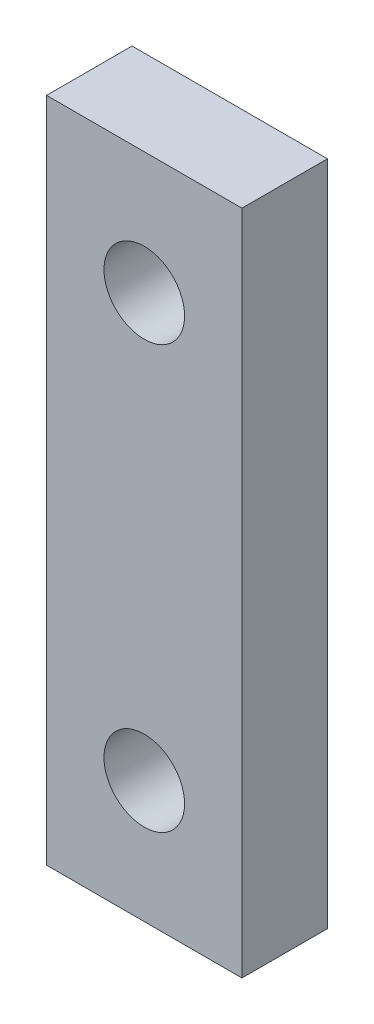
ISO-10303-21;
HEADER;
FILE_DESCRIPTION(('STEP AP214'),'2;1');
FILE_NAME('part.step','',(''),(''),'','','');
FILE_SCHEMA(('AUTOMOTIVE_DESIGN { 1 0 10303 214 1 1 1 1 }'));
ENDSEC;
DATA;
#1=APPLICATION_CONTEXT('core data for automotive mechanical design processes');
#2=APPLICATION_PROTOCOL_DEFINITION('international standard','automotive_design',2000,#1);
#3=PRODUCT_CONTEXT('',#1,'mechanical');
#4=PRODUCT('Part','Part','',(#3));
#5=PRODUCT_RELATED_PRODUCT_CATEGORY('part','',(#4));
#6=PRODUCT_DEFINITION_FORMATION('','',#4);
#7=PRODUCT_DEFINITION_CONTEXT('part definition',#1,'design');
#8=PRODUCT_DEFINITION('design','',#6,#7);
#9=PRODUCT_DEFINITION_SHAPE('','',#8);
#10=(LENGTH_UNIT() NAMED_UNIT(*) SI_UNIT(.MILLI.,.METRE.));
#11=(NAMED_UNIT(*) PLANE_ANGLE_UNIT() SI_UNIT($,.RADIAN.));
#12=(NAMED_UNIT(*) SI_UNIT($,.STERADIAN.) SOLID_ANGLE_UNIT());
#13=UNCERTAINTY_MEASURE_WITH_UNIT(LENGTH_MEASURE(1.E-05),#10,'distance_accuracy_value','');
#14=(GEOMETRIC_REPRESENTATION_CONTEXT(3) GLOBAL_UNCERTAINTY_ASSIGNED_CONTEXT((#13)) GLOBAL_UNIT_ASSIGNED_CONTEXT((#10,
#11,#12)) REPRESENTATION_CONTEXT('',''));
#15=CARTESIAN_POINT('',(0.,0.,0.));
#16=DIRECTION('',(0.,0.,1.));
#17=DIRECTION('',(1.,0.,0.));
#18=AXIS2_PLACEMENT_3D('',#15,#16,#17);
#19=CARTESIAN_POINT('',(0.,0.,3.5));
#20=DIRECTION('',(0.,0.,-1.));
#21=DIRECTION('',(-1.,0.,0.));
#22=AXIS2_PLACEMENT_3D('',#19,#20,#21);
#23=PLANE('',#22);
#24=DIRECTION('',(0.,-1.,0.));
#25=VECTOR('',#24,1.);
#26=CARTESIAN_POINT('',(0.,0.,3.5));
#27=LINE('',#26,#25);
#28=CARTESIAN_POINT('',(0.,27.3,3.5));
#29=VERTEX_POINT('',#28);
#30=CARTESIAN_POINT('',(0.,0.,3.5));
#31=VERTEX_POINT('',#30);
#32=EDGE_CURVE('E91',#29,#31,#27,.T.);
#33=ORIENTED_EDGE('',*,*,#32,.T.);
#34=DIRECTION('',(1.,0.,0.));
#35=VECTOR('',#34,1.);
#36=CARTESIAN_POINT('',(0.,0.,3.5));
#37=LINE('',#36,#35);
#38=CARTESIAN_POINT('',(8.,0.,3.5));
#39=VERTEX_POINT('',#38);
#40=EDGE_CURVE('E86',#31,#39,#37,.T.);
#41=ORIENTED_EDGE('',*,*,#40,.T.);
#42=DIRECTION('',(0.,1.,0.));
#43=VECTOR('',#42,1.);
#44=CARTESIAN_POINT('',(8.,0.,3.5));
#45=LINE('',#44,#43);
#46=CARTESIAN_POINT('',(8.,27.3,3.5));
#47=VERTEX_POINT('',#46);
#48=EDGE_CURVE('E89',#39,#47,#45,.T.);
#49=ORIENTED_EDGE('',*,*,#48,.T.);
#50=DIRECTION('',(-1.,0.,0.));
#51=VECTOR('',#50,1.);
#52=CARTESIAN_POINT('',(0.,27.3,3.5));
#53=LINE('',#52,#51);
#54=EDGE_CURVE('E56',#47,#29,#53,.T.);
#55=ORIENTED_EDGE('',*,*,#54,.T.);
#56=EDGE_LOOP('',(#33,#41,#49,#55));
#57=FACE_BOUND('',#56,.T.);
#58=CARTESIAN_POINT('',(4.,22.3,3.5));
#59=DIRECTION('',(0.,0.,1.));
#60=DIRECTION('',(1.,0.,0.));
#61=AXIS2_PLACEMENT_3D('',#58,#59,#60);
#62=CIRCLE('',#61,1.65);
#63=CARTESIAN_POINT('',(5.65,22.3,3.5));
#64=VERTEX_POINT('',#63);
#65=EDGE_CURVE('E106',#64,#64,#62,.T.);
#66=ORIENTED_EDGE('',*,*,#65,.F.);
#67=EDGE_LOOP('',(#66));
#68=FACE_BOUND('',#67,.T.);
#69=CARTESIAN_POINT('',(4.,5.,3.5));
#70=DIRECTION('',(0.,0.,1.));
#71=DIRECTION('',(1.,0.,0.));
#72=AXIS2_PLACEMENT_3D('',#69,#70,#71);
#73=CIRCLE('',#72,1.65);
#74=CARTESIAN_POINT('',(5.65,5.,3.5));
#75=VERTEX_POINT('',#74);
#76=EDGE_CURVE('E121',#75,#75,#73,.T.);
#77=ORIENTED_EDGE('',*,*,#76,.F.);
#78=EDGE_LOOP('',(#77));
#79=FACE_BOUND('',#78,.T.);
#80=ADVANCED_FACE('F39',(#57,#68,#79),#23,.F.);
#81=CARTESIAN_POINT('',(0.,0.,0.));
#82=DIRECTION('',(0.,0.,-1.));
#83=DIRECTION('',(-1.,0.,0.));
#84=AXIS2_PLACEMENT_3D('',#81,#82,#83);
#85=PLANE('',#84);
#86=CARTESIAN_POINT('',(4.,22.3,0.));
#87=DIRECTION('',(0.,0.,1.));
#88=DIRECTION('',(1.,0.,0.));
#89=AXIS2_PLACEMENT_3D('',#86,#87,#88);
#90=CIRCLE('',#89,1.65);
#91=CARTESIAN_POINT('',(5.65,22.3,0.));
#92=VERTEX_POINT('',#91);
#93=EDGE_CURVE('E118',#92,#92,#90,.T.);
#94=ORIENTED_EDGE('',*,*,#93,.T.);
#95=EDGE_LOOP('',(#94));
#96=FACE_BOUND('',#95,.T.);
#97=DIRECTION('',(0.,-1.,0.));
#98=VECTOR('',#97,1.);
#99=CARTESIAN_POINT('',(0.,0.,0.));
#100=LINE('',#99,#98);
#101=CARTESIAN_POINT('',(0.,27.3,0.));
#102=VERTEX_POINT('',#101);
#103=CARTESIAN_POINT('',(0.,0.,0.));
#104=VERTEX_POINT('',#103);
#105=EDGE_CURVE('E103',#102,#104,#100,.T.);
#106=ORIENTED_EDGE('',*,*,#105,.F.);
#107=DIRECTION('',(-1.,0.,0.));
#108=VECTOR('',#107,1.);
#109=CARTESIAN_POINT('',(0.,27.3,0.));
#110=LINE('',#109,#108);
#111=CARTESIAN_POINT('',(8.,27.3,0.));
#112=VERTEX_POINT('',#111);
#113=EDGE_CURVE('E79',#112,#102,#110,.T.);
#114=ORIENTED_EDGE('',*,*,#113,.F.);
#115=DIRECTION('',(0.,1.,0.));
#116=VECTOR('',#115,1.);
#117=CARTESIAN_POINT('',(8.,0.,0.));
#118=LINE('',#117,#116);
#119=CARTESIAN_POINT('',(8.,0.,0.));
#120=VERTEX_POINT('',#119);
#121=EDGE_CURVE('E73',#120,#112,#118,.T.);
#122=ORIENTED_EDGE('',*,*,#121,.F.);
#123=DIRECTION('',(1.,0.,0.));
#124=VECTOR('',#123,1.);
#125=CARTESIAN_POINT('',(0.,0.,0.));
#126=LINE('',#125,#124);
#127=EDGE_CURVE('E95',#104,#120,#126,.T.);
#128=ORIENTED_EDGE('',*,*,#127,.F.);
#129=EDGE_LOOP('',(#106,#114,#122,#128));
#130=FACE_BOUND('',#129,.T.);
#131=CARTESIAN_POINT('',(4.,5.,0.));
#132=DIRECTION('',(0.,0.,1.));
#133=DIRECTION('',(1.,0.,0.));
#134=AXIS2_PLACEMENT_3D('',#131,#132,#133);
#135=CIRCLE('',#134,1.65);
#136=CARTESIAN_POINT('',(5.65,5.,0.));
#137=VERTEX_POINT('',#136);
#138=EDGE_CURVE('E124',#137,#137,#135,.T.);
#139=ORIENTED_EDGE('',*,*,#138,.T.);
#140=EDGE_LOOP('',(#139));
#141=FACE_BOUND('',#140,.T.);
#142=ADVANCED_FACE('F114',(#96,#130,#141),#85,.T.);
#143=CARTESIAN_POINT('',(0.,0.,3.5));
#144=DIRECTION('',(1.,0.,0.));
#145=DIRECTION('',(0.,1.,0.));
#146=AXIS2_PLACEMENT_3D('',#143,#144,#145);
#147=PLANE('',#146);
#148=ORIENTED_EDGE('',*,*,#105,.T.);
#149=DIRECTION('',(0.,0.,-1.));
#150=VECTOR('',#149,1.);
#151=CARTESIAN_POINT('',(0.,0.,3.5));
#152=LINE('',#151,#150);
#153=EDGE_CURVE('E11',#31,#104,#152,.T.);
#154=ORIENTED_EDGE('',*,*,#153,.F.);
#155=ORIENTED_EDGE('',*,*,#32,.F.);
#156=DIRECTION('',(0.,0.,-1.));
#157=VECTOR('',#156,1.);
#158=CARTESIAN_POINT('',(0.,27.3,3.5));
#159=LINE('',#158,#157);
#160=EDGE_CURVE('E99',#29,#102,#159,.T.);
#161=ORIENTED_EDGE('',*,*,#160,.T.);
#162=EDGE_LOOP('',(#148,#154,#155,#161));
#163=FACE_BOUND('',#162,.T.);
#164=ADVANCED_FACE('F41',(#163),#147,.F.);
#165=CARTESIAN_POINT('',(0.,0.,3.5));
#166=DIRECTION('',(0.,1.,0.));
#167=DIRECTION('',(-1.,0.,0.));
#168=AXIS2_PLACEMENT_3D('',#165,#166,#167);
#169=PLANE('',#168);
#170=ORIENTED_EDGE('',*,*,#127,.T.);
#171=DIRECTION('',(0.,0.,-1.));
#172=VECTOR('',#171,1.);
#173=CARTESIAN_POINT('',(8.,0.,3.5));
#174=LINE('',#173,#172);
#175=EDGE_CURVE('E48',#39,#120,#174,.T.);
#176=ORIENTED_EDGE('',*,*,#175,.F.);
#177=ORIENTED_EDGE('',*,*,#40,.F.);
#178=ORIENTED_EDGE('',*,*,#153,.T.);
#179=EDGE_LOOP('',(#170,#176,#177,#178));
#180=FACE_BOUND('',#179,.T.);
#181=ADVANCED_FACE('F94',(#180),#169,.F.);
#182=CARTESIAN_POINT('',(8.,0.,3.5));
#183=DIRECTION('',(-1.,0.,0.));
#184=DIRECTION('',(0.,-1.,0.));
#185=AXIS2_PLACEMENT_3D('',#182,#183,#184);
#186=PLANE('',#185);
#187=ORIENTED_EDGE('',*,*,#121,.T.);
#188=DIRECTION('',(0.,0.,-1.));
#189=VECTOR('',#188,1.);
#190=CARTESIAN_POINT('',(8.,27.3,3.5));
#191=LINE('',#190,#189);
#192=EDGE_CURVE('E96',#47,#112,#191,.T.);
#193=ORIENTED_EDGE('',*,*,#192,.F.);
#194=ORIENTED_EDGE('',*,*,#48,.F.);
#195=ORIENTED_EDGE('',*,*,#175,.T.);
#196=EDGE_LOOP('',(#187,#193,#194,#195));
#197=FACE_BOUND('',#196,.T.);
#198=ADVANCED_FACE('F97',(#197),#186,.F.);
#199=CARTESIAN_POINT('',(0.,27.3,3.5));
#200=DIRECTION('',(0.,-1.,0.));
#201=DIRECTION('',(0.,0.,-1.));
#202=AXIS2_PLACEMENT_3D('',#199,#200,#201);
#203=PLANE('',#202);
#204=ORIENTED_EDGE('',*,*,#113,.T.);
#205=ORIENTED_EDGE('',*,*,#160,.F.);
#206=ORIENTED_EDGE('',*,*,#54,.F.);
#207=ORIENTED_EDGE('',*,*,#192,.T.);
#208=EDGE_LOOP('',(#204,#205,#206,#207));
#209=FACE_BOUND('',#208,.T.);
#210=ADVANCED_FACE('F111',(#209),#203,.F.);
#211=CARTESIAN_POINT('',(4.,22.3,3.5));
#212=DIRECTION('',(0.,0.,-1.));
#213=DIRECTION('',(-1.,0.,0.));
#214=AXIS2_PLACEMENT_3D('',#211,#212,#213);
#215=CYLINDRICAL_SURFACE('',#214,1.65);
#216=ORIENTED_EDGE('',*,*,#65,.T.);
#217=EDGE_LOOP('',(#216));
#218=FACE_BOUND('',#217,.T.);
#219=ORIENTED_EDGE('',*,*,#93,.F.);
#220=EDGE_LOOP('',(#219));
#221=FACE_BOUND('',#220,.T.);
#222=ADVANCED_FACE('F141',(#218,#221),#215,.F.);
#223=CARTESIAN_POINT('',(4.,5.,3.5));
#224=DIRECTION('',(0.,0.,-1.));
#225=DIRECTION('',(-1.,0.,0.));
#226=AXIS2_PLACEMENT_3D('',#223,#224,#225);
#227=CYLINDRICAL_SURFACE('',#226,1.65);
#228=ORIENTED_EDGE('',*,*,#76,.T.);
#229=EDGE_LOOP('',(#228));
#230=FACE_BOUND('',#229,.T.);
#231=ORIENTED_EDGE('',*,*,#138,.F.);
#232=EDGE_LOOP('',(#231));
#233=FACE_BOUND('',#232,.T.);
#234=ADVANCED_FACE('F130',(#230,#233),#227,.F.);
#235=CLOSED_SHELL('',(#80,#142,#164,#181,#198,#210,#222,#234));
#236=MANIFOLD_SOLID_BREP('B2',#235);
#237=ADVANCED_BREP_SHAPE_REPRESENTATION('',(#18,#236),#14);
#238=SHAPE_DEFINITION_REPRESENTATION(#9,#237);
ENDSEC;
END-ISO-10303-21;
